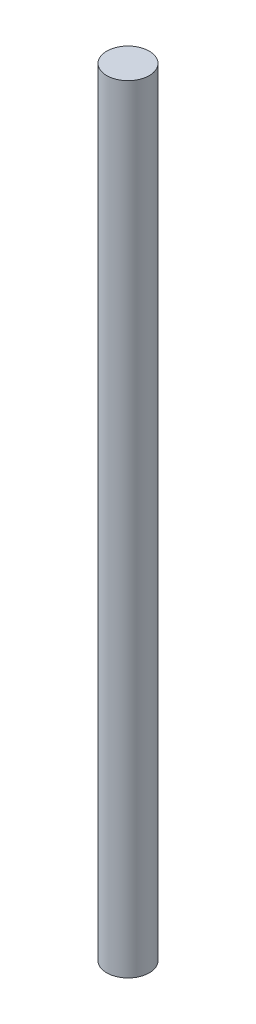
ISO-10303-21;
HEADER;
FILE_DESCRIPTION(('STEP AP214'),'2;1');
FILE_NAME('part.step','',(''),(''),'','','');
FILE_SCHEMA(('AUTOMOTIVE_DESIGN { 1 0 10303 214 1 1 1 1 }'));
ENDSEC;
DATA;
#1=APPLICATION_CONTEXT('core data for automotive mechanical design processes');
#2=APPLICATION_PROTOCOL_DEFINITION('international standard','automotive_design',2000,#1);
#3=PRODUCT_CONTEXT('',#1,'mechanical');
#4=PRODUCT('Part','Part','',(#3));
#5=PRODUCT_RELATED_PRODUCT_CATEGORY('part','',(#4));
#6=PRODUCT_DEFINITION_FORMATION('','',#4);
#7=PRODUCT_DEFINITION_CONTEXT('part definition',#1,'design');
#8=PRODUCT_DEFINITION('design','',#6,#7);
#9=PRODUCT_DEFINITION_SHAPE('','',#8);
#10=(LENGTH_UNIT() NAMED_UNIT(*) SI_UNIT(.MILLI.,.METRE.));
#11=(NAMED_UNIT(*) PLANE_ANGLE_UNIT() SI_UNIT($,.RADIAN.));
#12=(NAMED_UNIT(*) SI_UNIT($,.STERADIAN.) SOLID_ANGLE_UNIT());
#13=UNCERTAINTY_MEASURE_WITH_UNIT(LENGTH_MEASURE(1.E-05),#10,'distance_accuracy_value','');
#14=(GEOMETRIC_REPRESENTATION_CONTEXT(3) GLOBAL_UNCERTAINTY_ASSIGNED_CONTEXT((#13)) GLOBAL_UNIT_ASSIGNED_CONTEXT((#10,
#11,#12)) REPRESENTATION_CONTEXT('',''));
#15=CARTESIAN_POINT('',(0.,0.,0.));
#16=DIRECTION('',(0.,0.,1.));
#17=DIRECTION('',(1.,0.,0.));
#18=AXIS2_PLACEMENT_3D('',#15,#16,#17);
#19=CARTESIAN_POINT('',(0.,125.,0.));
#20=DIRECTION('',(0.,-1.,0.));
#21=DIRECTION('',(0.,0.,-1.));
#22=AXIS2_PLACEMENT_3D('',#19,#20,#21);
#23=CYLINDRICAL_SURFACE('',#22,4.);
#24=CARTESIAN_POINT('',(0.,125.,0.));
#25=DIRECTION('',(0.,1.,0.));
#26=DIRECTION('',(0.,0.,1.));
#27=AXIS2_PLACEMENT_3D('',#24,#25,#26);
#28=CIRCLE('',#27,4.);
#29=CARTESIAN_POINT('',(0.,125.,4.));
#30=VERTEX_POINT('',#29);
#31=EDGE_CURVE('E10',#30,#30,#28,.T.);
#32=ORIENTED_EDGE('',*,*,#31,.F.);
#33=EDGE_LOOP('',(#32));
#34=FACE_BOUND('',#33,.T.);
#35=CARTESIAN_POINT('',(0.,-21.39,0.));
#36=DIRECTION('',(0.,-1.,0.));
#37=DIRECTION('',(1.,0.,0.));
#38=AXIS2_PLACEMENT_3D('',#35,#36,#37);
#39=CIRCLE('',#38,4.);
#40=CARTESIAN_POINT('',(4.,-21.39,0.));
#41=VERTEX_POINT('',#40);
#42=EDGE_CURVE('E45',#41,#41,#39,.T.);
#43=ORIENTED_EDGE('',*,*,#42,.F.);
#44=EDGE_LOOP('',(#43));
#45=FACE_BOUND('',#44,.T.);
#46=ADVANCED_FACE('F39',(#34,#45),#23,.T.);
#47=CARTESIAN_POINT('',(0.,125.,0.));
#48=DIRECTION('',(0.,1.,0.));
#49=DIRECTION('',(0.,0.,1.));
#50=AXIS2_PLACEMENT_3D('',#47,#48,#49);
#51=PLANE('',#50);
#52=ORIENTED_EDGE('',*,*,#31,.T.);
#53=EDGE_LOOP('',(#52));
#54=FACE_BOUND('',#53,.T.);
#55=ADVANCED_FACE('F54',(#54),#51,.T.);
#56=CARTESIAN_POINT('',(-1.69965778360472,-21.39,58.6676505520349));
#57=DIRECTION('',(0.,-1.,0.));
#58=DIRECTION('',(0.451144892295875,0.,0.892450719174647));
#59=AXIS2_PLACEMENT_3D('',#56,#57,#58);
#60=PLANE('',#59);
#61=ORIENTED_EDGE('',*,*,#42,.T.);
#62=EDGE_LOOP('',(#61));
#63=FACE_BOUND('',#62,.T.);
#64=ADVANCED_FACE('F51',(#63),#60,.T.);
#65=CLOSED_SHELL('',(#46,#55,#64));
#66=MANIFOLD_SOLID_BREP('B2',#65);
#67=ADVANCED_BREP_SHAPE_REPRESENTATION('',(#18,#66),#14);
#68=SHAPE_DEFINITION_REPRESENTATION(#9,#67);
ENDSEC;
END-ISO-10303-21;
